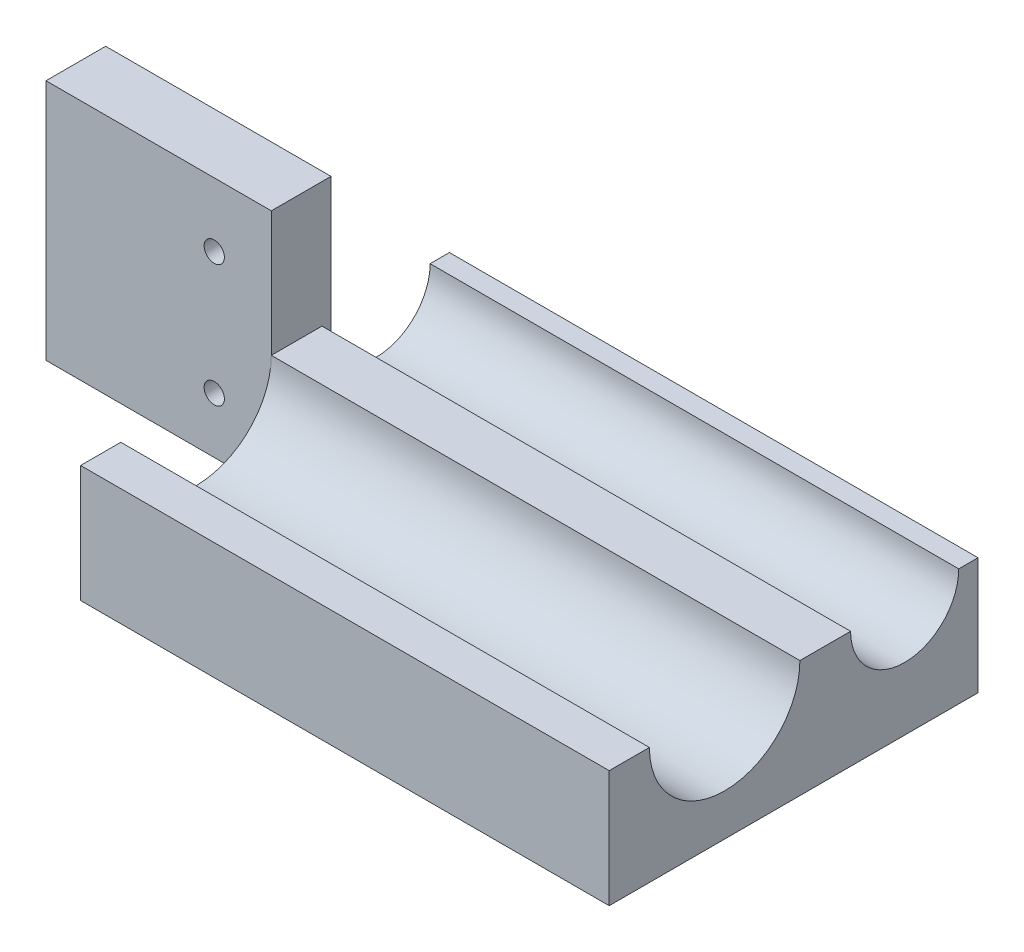
ISO-10303-21;
HEADER;
FILE_DESCRIPTION(('STEP AP214'),'2;1');
FILE_NAME('part.step','',(''),(''),'','','');
FILE_SCHEMA(('AUTOMOTIVE_DESIGN { 1 0 10303 214 1 1 1 1 }'));
ENDSEC;
DATA;
#1=APPLICATION_CONTEXT('core data for automotive mechanical design processes');
#2=APPLICATION_PROTOCOL_DEFINITION('international standard','automotive_design',2000,#1);
#3=PRODUCT_CONTEXT('',#1,'mechanical');
#4=PRODUCT('Part','Part','',(#3));
#5=PRODUCT_RELATED_PRODUCT_CATEGORY('part','',(#4));
#6=PRODUCT_DEFINITION_FORMATION('','',#4);
#7=PRODUCT_DEFINITION_CONTEXT('part definition',#1,'design');
#8=PRODUCT_DEFINITION('design','',#6,#7);
#9=PRODUCT_DEFINITION_SHAPE('','',#8);
#10=(LENGTH_UNIT() NAMED_UNIT(*) SI_UNIT(.MILLI.,.METRE.));
#11=(NAMED_UNIT(*) PLANE_ANGLE_UNIT() SI_UNIT($,.RADIAN.));
#12=(NAMED_UNIT(*) SI_UNIT($,.STERADIAN.) SOLID_ANGLE_UNIT());
#13=UNCERTAINTY_MEASURE_WITH_UNIT(LENGTH_MEASURE(1.E-05),#10,'distance_accuracy_value','');
#14=(GEOMETRIC_REPRESENTATION_CONTEXT(3) GLOBAL_UNCERTAINTY_ASSIGNED_CONTEXT((#13)) GLOBAL_UNIT_ASSIGNED_CONTEXT((#10,
#11,#12)) REPRESENTATION_CONTEXT('',''));
#15=CARTESIAN_POINT('',(0.,0.,0.));
#16=DIRECTION('',(0.,0.,1.));
#17=DIRECTION('',(1.,0.,0.));
#18=AXIS2_PLACEMENT_3D('',#15,#16,#17);
#19=CARTESIAN_POINT('',(-12.6639051339058,12.3607550837009,-35.9560648225148));
#20=DIRECTION('',(0.,0.,-1.));
#21=DIRECTION('',(-1.,0.,0.));
#22=AXIS2_PLACEMENT_3D('',#19,#20,#21);
#23=CYLINDRICAL_SURFACE('',#22,2.25);
#24=CARTESIAN_POINT('',(-12.6639051339058,12.3607550837009,-42.3200258531937));
#25=DIRECTION('',(0.,0.,-1.));
#26=DIRECTION('',(-1.,0.,0.));
#27=AXIS2_PLACEMENT_3D('',#24,#25,#26);
#28=CIRCLE('',#27,2.25);
#29=CARTESIAN_POINT('',(-14.9139051339058,12.3607550837009,-42.3200258531937));
#30=VERTEX_POINT('',#29);
#31=EDGE_CURVE('E228',#30,#30,#28,.F.);
#32=ORIENTED_EDGE('',*,*,#31,.T.);
#33=EDGE_LOOP('',(#32));
#34=FACE_BOUND('',#33,.T.);
#35=CARTESIAN_POINT('',(-12.6639051339058,12.3607550837009,-51.0625058614753));
#36=DIRECTION('',(0.,0.,-1.));
#37=DIRECTION('',(-1.,0.,0.));
#38=AXIS2_PLACEMENT_3D('',#35,#36,#37);
#39=CIRCLE('',#38,2.25);
#40=CARTESIAN_POINT('',(-14.9139051339058,12.3607550837009,-51.0625058614753));
#41=VERTEX_POINT('',#40);
#42=EDGE_CURVE('E41',#41,#41,#39,.F.);
#43=ORIENTED_EDGE('',*,*,#42,.F.);
#44=EDGE_LOOP('',(#43));
#45=FACE_BOUND('',#44,.T.);
#46=ADVANCED_FACE('F37',(#34,#45),#23,.F.);
#47=CARTESIAN_POINT('',(-12.6639051339058,39.5607550837009,-35.9560648225148));
#48=DIRECTION('',(0.,0.,-1.));
#49=DIRECTION('',(-1.,0.,0.));
#50=AXIS2_PLACEMENT_3D('',#47,#48,#49);
#51=CYLINDRICAL_SURFACE('',#50,2.25);
#52=CARTESIAN_POINT('',(-12.6639051339058,39.5607550837009,-42.3200258531937));
#53=DIRECTION('',(0.,0.,-1.));
#54=DIRECTION('',(-1.,0.,0.));
#55=AXIS2_PLACEMENT_3D('',#52,#53,#54);
#56=CIRCLE('',#55,2.25);
#57=CARTESIAN_POINT('',(-14.9139051339058,39.5607550837009,-42.3200258531937));
#58=VERTEX_POINT('',#57);
#59=EDGE_CURVE('E243',#58,#58,#56,.F.);
#60=ORIENTED_EDGE('',*,*,#59,.T.);
#61=EDGE_LOOP('',(#60));
#62=FACE_BOUND('',#61,.T.);
#63=CARTESIAN_POINT('',(-12.6639051339058,39.5607550837009,-51.0625058614753));
#64=DIRECTION('',(0.,0.,-1.));
#65=DIRECTION('',(-1.,0.,0.));
#66=AXIS2_PLACEMENT_3D('',#63,#64,#65);
#67=CIRCLE('',#66,2.25);
#68=CARTESIAN_POINT('',(-14.9139051339058,39.5607550837009,-51.0625058614753));
#69=VERTEX_POINT('',#68);
#70=EDGE_CURVE('E222',#69,#69,#67,.F.);
#71=ORIENTED_EDGE('',*,*,#70,.F.);
#72=EDGE_LOOP('',(#71));
#73=FACE_BOUND('',#72,.T.);
#74=ADVANCED_FACE('F304',(#62,#73),#51,.F.);
#75=CARTESIAN_POINT('',(0.,0.,0.));
#76=DIRECTION('',(1.,0.,0.));
#77=DIRECTION('',(0.,0.,-1.));
#78=AXIS2_PLACEMENT_3D('',#75,#76,#77);
#79=PLANE('',#78);
#80=DIRECTION('',(0.,-1.,0.));
#81=VECTOR('',#80,1.);
#82=CARTESIAN_POINT('',(0.,0.,-55.5625058614753));
#83=LINE('',#82,#81);
#84=CARTESIAN_POINT('',(0.,19.3275055029901,-55.5625058614753));
#85=VERTEX_POINT('',#84);
#86=CARTESIAN_POINT('',(0.,0.,-55.5625058614753));
#87=VERTEX_POINT('',#86);
#88=EDGE_CURVE('E11',#85,#87,#83,.T.);
#89=ORIENTED_EDGE('',*,*,#88,.F.);
#90=CARTESIAN_POINT('',(0.,25.9607550837009,-65.5625058614753));
#91=DIRECTION('',(1.,0.,0.));
#92=DIRECTION('',(0.,0.,-1.));
#93=AXIS2_PLACEMENT_3D('',#90,#91,#92);
#94=CIRCLE('',#93,12.);
#95=CARTESIAN_POINT('',(0.,25.9607550837009,-77.5625058614753));
#96=VERTEX_POINT('',#95);
#97=EDGE_CURVE('E155',#85,#96,#94,.T.);
#98=ORIENTED_EDGE('',*,*,#97,.T.);
#99=DIRECTION('',(0.,0.,-1.));
#100=VECTOR('',#99,1.);
#101=CARTESIAN_POINT('',(0.,25.9607550837006,1.05279507022553E-13));
#102=LINE('',#101,#100);
#103=CARTESIAN_POINT('',(0.,25.9607550837009,-81.8401409465382));
#104=VERTEX_POINT('',#103);
#105=EDGE_CURVE('E167',#96,#104,#102,.T.);
#106=ORIENTED_EDGE('',*,*,#105,.T.);
#107=DIRECTION('',(0.,1.,0.));
#108=VECTOR('',#107,1.);
#109=CARTESIAN_POINT('',(0.,0.,-81.8401409465382));
#110=LINE('',#109,#108);
#111=CARTESIAN_POINT('',(0.,0.,-81.8401409465382));
#112=VERTEX_POINT('',#111);
#113=EDGE_CURVE('E201',#112,#104,#110,.T.);
#114=ORIENTED_EDGE('',*,*,#113,.F.);
#115=DIRECTION('',(0.,0.,-1.));
#116=VECTOR('',#115,1.);
#117=CARTESIAN_POINT('',(0.,0.,0.));
#118=LINE('',#117,#116);
#119=EDGE_CURVE('E55',#87,#112,#118,.T.);
#120=ORIENTED_EDGE('',*,*,#119,.F.);
#121=EDGE_LOOP('',(#89,#98,#106,#114,#120));
#122=FACE_BOUND('',#121,.T.);
#123=ADVANCED_FACE('F270',(#122),#79,.F.);
#124=DIRECTION('',(0.,1.,0.));
#125=VECTOR('',#124,1.);
#126=CARTESIAN_POINT('',(0.,0.,-42.3200258531937));
#127=LINE('',#126,#125);
#128=CARTESIAN_POINT('',(0.,0.,-42.3200258531937));
#129=VERTEX_POINT('',#128);
#130=CARTESIAN_POINT('',(0.,25.9607550837009,-42.3200258531937));
#131=VERTEX_POINT('',#130);
#132=EDGE_CURVE('E62',#129,#131,#127,.T.);
#133=ORIENTED_EDGE('',*,*,#132,.F.);
#134=CARTESIAN_POINT('',(0.,0.,0.));
#135=VERTEX_POINT('',#134);
#136=EDGE_CURVE('E199',#135,#129,#118,.T.);
#137=ORIENTED_EDGE('',*,*,#136,.F.);
#138=DIRECTION('',(0.,1.,0.));
#139=VECTOR('',#138,1.);
#140=CARTESIAN_POINT('',(0.,0.,0.));
#141=LINE('',#140,#139);
#142=CARTESIAN_POINT('',(0.,25.9607550837009,0.));
#143=VERTEX_POINT('',#142);
#144=EDGE_CURVE('E196',#135,#143,#141,.T.);
#145=ORIENTED_EDGE('',*,*,#144,.T.);
#146=DIRECTION('',(0.,0.,-1.));
#147=VECTOR('',#146,1.);
#148=CARTESIAN_POINT('',(0.,25.9607550837009,0.));
#149=LINE('',#148,#147);
#150=CARTESIAN_POINT('',(0.,25.9607550837009,-8.9200258531937));
#151=VERTEX_POINT('',#150);
#152=EDGE_CURVE('E193',#143,#151,#149,.T.);
#153=ORIENTED_EDGE('',*,*,#152,.T.);
#154=CARTESIAN_POINT('',(0.,25.9607550837009,-25.6200258531937));
#155=DIRECTION('',(1.,0.,0.));
#156=DIRECTION('',(0.,0.,-1.));
#157=AXIS2_PLACEMENT_3D('',#154,#155,#156);
#158=CIRCLE('',#157,16.7);
#159=EDGE_CURVE('E191',#151,#131,#158,.T.);
#160=ORIENTED_EDGE('',*,*,#159,.T.);
#161=EDGE_LOOP('',(#133,#137,#145,#153,#160));
#162=FACE_BOUND('',#161,.T.);
#163=ADVANCED_FACE('F289',(#162),#79,.F.);
#164=CARTESIAN_POINT('',(117.3,25.9607550837009,-65.5625058614753));
#165=DIRECTION('',(-1.,0.,0.));
#166=DIRECTION('',(0.,0.,1.));
#167=AXIS2_PLACEMENT_3D('',#164,#165,#166);
#168=CYLINDRICAL_SURFACE('',#167,12.);
#169=CARTESIAN_POINT('',(0.,25.9607550837009,-53.5625058614753));
#170=VERTEX_POINT('',#169);
#171=EDGE_CURVE('E157',#170,#85,#94,.T.);
#172=ORIENTED_EDGE('',*,*,#171,.F.);
#173=DIRECTION('',(-1.,0.,0.));
#174=VECTOR('',#173,1.);
#175=CARTESIAN_POINT('',(117.3,25.9607550837009,-53.5625058614753));
#176=LINE('',#175,#174);
#177=CARTESIAN_POINT('',(117.3,25.9607550837009,-53.5625058614753));
#178=VERTEX_POINT('',#177);
#179=EDGE_CURVE('E46',#178,#170,#176,.T.);
#180=ORIENTED_EDGE('',*,*,#179,.F.);
#181=CARTESIAN_POINT('',(117.3,25.9607550837009,-65.5625058614753));
#182=DIRECTION('',(1.,0.,0.));
#183=DIRECTION('',(0.,0.,-1.));
#184=AXIS2_PLACEMENT_3D('',#181,#182,#183);
#185=CIRCLE('',#184,12.);
#186=CARTESIAN_POINT('',(117.3,25.9607550837009,-77.5625058614753));
#187=VERTEX_POINT('',#186);
#188=EDGE_CURVE('E163',#178,#187,#185,.T.);
#189=ORIENTED_EDGE('',*,*,#188,.T.);
#190=DIRECTION('',(-1.,0.,0.));
#191=VECTOR('',#190,1.);
#192=CARTESIAN_POINT('',(117.3,25.9607550837009,-77.5625058614753));
#193=LINE('',#192,#191);
#194=EDGE_CURVE('E185',#187,#96,#193,.T.);
#195=ORIENTED_EDGE('',*,*,#194,.T.);
#196=ORIENTED_EDGE('',*,*,#97,.F.);
#197=EDGE_LOOP('',(#172,#180,#189,#195,#196));
#198=FACE_BOUND('',#197,.T.);
#199=ADVANCED_FACE('F39',(#198),#168,.F.);
#200=CARTESIAN_POINT('',(117.3,25.9607550837009,0.));
#201=DIRECTION('',(0.,1.,0.));
#202=DIRECTION('',(0.,0.,1.));
#203=AXIS2_PLACEMENT_3D('',#200,#201,#202);
#204=PLANE('',#203);
#205=DIRECTION('',(0.,0.,-1.));
#206=VECTOR('',#205,1.);
#207=CARTESIAN_POINT('',(0.,25.9607550837009,0.));
#208=LINE('',#207,#206);
#209=EDGE_CURVE('E188',#131,#170,#208,.T.);
#210=ORIENTED_EDGE('',*,*,#209,.F.);
#211=DIRECTION('',(-1.,0.,0.));
#212=VECTOR('',#211,1.);
#213=CARTESIAN_POINT('',(117.3,25.9607550837009,-42.3200258531937));
#214=LINE('',#213,#212);
#215=CARTESIAN_POINT('',(117.3,25.9607550837009,-42.3200258531937));
#216=VERTEX_POINT('',#215);
#217=EDGE_CURVE('E219',#216,#131,#214,.T.);
#218=ORIENTED_EDGE('',*,*,#217,.F.);
#219=DIRECTION('',(0.,0.,-1.));
#220=VECTOR('',#219,1.);
#221=CARTESIAN_POINT('',(117.3,25.9607550837009,0.));
#222=LINE('',#221,#220);
#223=EDGE_CURVE('E166',#216,#178,#222,.T.);
#224=ORIENTED_EDGE('',*,*,#223,.T.);
#225=ORIENTED_EDGE('',*,*,#179,.T.);
#226=EDGE_LOOP('',(#210,#218,#224,#225));
#227=FACE_BOUND('',#226,.T.);
#228=ADVANCED_FACE('F411',(#227),#204,.T.);
#229=CARTESIAN_POINT('',(117.3,25.9607550837009,-25.6200258531937));
#230=DIRECTION('',(-1.,0.,0.));
#231=DIRECTION('',(0.,0.,1.));
#232=AXIS2_PLACEMENT_3D('',#229,#230,#231);
#233=CYLINDRICAL_SURFACE('',#232,16.7);
#234=ORIENTED_EDGE('',*,*,#159,.F.);
#235=DIRECTION('',(-1.,0.,0.));
#236=VECTOR('',#235,1.);
#237=CARTESIAN_POINT('',(117.3,25.9607550837009,-8.9200258531937));
#238=LINE('',#237,#236);
#239=CARTESIAN_POINT('',(117.3,25.9607550837009,-8.9200258531937));
#240=VERTEX_POINT('',#239);
#241=EDGE_CURVE('E217',#240,#151,#238,.T.);
#242=ORIENTED_EDGE('',*,*,#241,.F.);
#243=CARTESIAN_POINT('',(117.3,25.9607550837009,-25.6200258531937));
#244=DIRECTION('',(1.,0.,0.));
#245=DIRECTION('',(0.,0.,-1.));
#246=AXIS2_PLACEMENT_3D('',#243,#244,#245);
#247=CIRCLE('',#246,16.7);
#248=EDGE_CURVE('E170',#240,#216,#247,.T.);
#249=ORIENTED_EDGE('',*,*,#248,.T.);
#250=ORIENTED_EDGE('',*,*,#217,.T.);
#251=EDGE_LOOP('',(#234,#242,#249,#250));
#252=FACE_BOUND('',#251,.T.);
#253=ADVANCED_FACE('F416',(#252),#233,.F.);
#254=CARTESIAN_POINT('',(117.3,25.9607550837009,0.));
#255=DIRECTION('',(0.,1.,0.));
#256=DIRECTION('',(0.,0.,1.));
#257=AXIS2_PLACEMENT_3D('',#254,#255,#256);
#258=PLANE('',#257);
#259=ORIENTED_EDGE('',*,*,#152,.F.);
#260=DIRECTION('',(-1.,0.,0.));
#261=VECTOR('',#260,1.);
#262=CARTESIAN_POINT('',(117.3,25.9607550837009,0.));
#263=LINE('',#262,#261);
#264=CARTESIAN_POINT('',(117.3,25.9607550837009,0.));
#265=VERTEX_POINT('',#264);
#266=EDGE_CURVE('E215',#265,#143,#263,.T.);
#267=ORIENTED_EDGE('',*,*,#266,.F.);
#268=DIRECTION('',(0.,0.,-1.));
#269=VECTOR('',#268,1.);
#270=CARTESIAN_POINT('',(117.3,25.9607550837009,0.));
#271=LINE('',#270,#269);
#272=EDGE_CURVE('E173',#265,#240,#271,.T.);
#273=ORIENTED_EDGE('',*,*,#272,.T.);
#274=ORIENTED_EDGE('',*,*,#241,.T.);
#275=EDGE_LOOP('',(#259,#267,#273,#274));
#276=FACE_BOUND('',#275,.T.);
#277=ADVANCED_FACE('F469',(#276),#258,.T.);
#278=CARTESIAN_POINT('',(117.3,0.,0.));
#279=DIRECTION('',(0.,0.,1.));
#280=DIRECTION('',(1.,0.,0.));
#281=AXIS2_PLACEMENT_3D('',#278,#279,#280);
#282=PLANE('',#281);
#283=ORIENTED_EDGE('',*,*,#144,.F.);
#284=DIRECTION('',(-1.,0.,0.));
#285=VECTOR('',#284,1.);
#286=CARTESIAN_POINT('',(117.3,0.,0.));
#287=LINE('',#286,#285);
#288=CARTESIAN_POINT('',(117.3,0.,0.));
#289=VERTEX_POINT('',#288);
#290=EDGE_CURVE('E213',#289,#135,#287,.T.);
#291=ORIENTED_EDGE('',*,*,#290,.F.);
#292=DIRECTION('',(0.,1.,0.));
#293=VECTOR('',#292,1.);
#294=CARTESIAN_POINT('',(117.3,0.,0.));
#295=LINE('',#294,#293);
#296=EDGE_CURVE('E176',#289,#265,#295,.T.);
#297=ORIENTED_EDGE('',*,*,#296,.T.);
#298=ORIENTED_EDGE('',*,*,#266,.T.);
#299=EDGE_LOOP('',(#283,#291,#297,#298));
#300=FACE_BOUND('',#299,.T.);
#301=ADVANCED_FACE('F287',(#300),#282,.T.);
#302=CARTESIAN_POINT('',(117.3,0.,0.));
#303=DIRECTION('',(0.,1.,0.));
#304=DIRECTION('',(0.,0.,1.));
#305=AXIS2_PLACEMENT_3D('',#302,#303,#304);
#306=PLANE('',#305);
#307=ORIENTED_EDGE('',*,*,#136,.T.);
#308=DIRECTION('',(1.,0.,0.));
#309=VECTOR('',#308,1.);
#310=CARTESIAN_POINT('',(-50.,0.,-42.3200258531937));
#311=LINE('',#310,#309);
#312=CARTESIAN_POINT('',(-50.,0.,-42.3200258531937));
#313=VERTEX_POINT('',#312);
#314=EDGE_CURVE('E138',#313,#129,#311,.T.);
#315=ORIENTED_EDGE('',*,*,#314,.F.);
#316=DIRECTION('',(0.,0.,1.));
#317=VECTOR('',#316,1.);
#318=CARTESIAN_POINT('',(-50.,0.,-55.5625058614753));
#319=LINE('',#318,#317);
#320=CARTESIAN_POINT('',(-50.,0.,-55.5625058614753));
#321=VERTEX_POINT('',#320);
#322=EDGE_CURVE('E132',#321,#313,#319,.T.);
#323=ORIENTED_EDGE('',*,*,#322,.F.);
#324=DIRECTION('',(1.,0.,0.));
#325=VECTOR('',#324,1.);
#326=CARTESIAN_POINT('',(-50.,0.,-55.5625058614753));
#327=LINE('',#326,#325);
#328=EDGE_CURVE('E136',#321,#87,#327,.T.);
#329=ORIENTED_EDGE('',*,*,#328,.T.);
#330=ORIENTED_EDGE('',*,*,#119,.T.);
#331=DIRECTION('',(-1.,0.,0.));
#332=VECTOR('',#331,1.);
#333=CARTESIAN_POINT('',(117.3,0.,-81.8401409465382));
#334=LINE('',#333,#332);
#335=CARTESIAN_POINT('',(117.3,0.,-81.8401409465382));
#336=VERTEX_POINT('',#335);
#337=EDGE_CURVE('E210',#336,#112,#334,.T.);
#338=ORIENTED_EDGE('',*,*,#337,.F.);
#339=DIRECTION('',(0.,0.,-1.));
#340=VECTOR('',#339,1.);
#341=CARTESIAN_POINT('',(117.3,0.,0.));
#342=LINE('',#341,#340);
#343=EDGE_CURVE('E179',#289,#336,#342,.T.);
#344=ORIENTED_EDGE('',*,*,#343,.F.);
#345=ORIENTED_EDGE('',*,*,#290,.T.);
#346=EDGE_LOOP('',(#307,#315,#323,#329,#330,#338,#344,#345));
#347=FACE_BOUND('',#346,.T.);
#348=ADVANCED_FACE('F134',(#347),#306,.F.);
#349=CARTESIAN_POINT('',(117.3,0.,-81.8401409465382));
#350=DIRECTION('',(0.,0.,1.));
#351=DIRECTION('',(0.,-1.,0.));
#352=AXIS2_PLACEMENT_3D('',#349,#350,#351);
#353=PLANE('',#352);
#354=ORIENTED_EDGE('',*,*,#113,.T.);
#355=DIRECTION('',(-1.,0.,0.));
#356=VECTOR('',#355,1.);
#357=CARTESIAN_POINT('',(117.3,25.9607550837009,-81.8401409465382));
#358=LINE('',#357,#356);
#359=CARTESIAN_POINT('',(117.3,25.9607550837009,-81.8401409465382));
#360=VERTEX_POINT('',#359);
#361=EDGE_CURVE('E208',#360,#104,#358,.T.);
#362=ORIENTED_EDGE('',*,*,#361,.F.);
#363=DIRECTION('',(0.,1.,0.));
#364=VECTOR('',#363,1.);
#365=CARTESIAN_POINT('',(117.3,0.,-81.8401409465382));
#366=LINE('',#365,#364);
#367=EDGE_CURVE('E181',#336,#360,#366,.T.);
#368=ORIENTED_EDGE('',*,*,#367,.F.);
#369=ORIENTED_EDGE('',*,*,#337,.T.);
#370=EDGE_LOOP('',(#354,#362,#368,#369));
#371=FACE_BOUND('',#370,.T.);
#372=ADVANCED_FACE('F277',(#371),#353,.F.);
#373=CARTESIAN_POINT('',(117.3,25.9607550837006,1.05279507022553E-13));
#374=DIRECTION('',(0.,1.,0.));
#375=DIRECTION('',(0.,0.,1.));
#376=AXIS2_PLACEMENT_3D('',#373,#374,#375);
#377=PLANE('',#376);
#378=ORIENTED_EDGE('',*,*,#105,.F.);
#379=ORIENTED_EDGE('',*,*,#194,.F.);
#380=DIRECTION('',(0.,0.,-1.));
#381=VECTOR('',#380,1.);
#382=CARTESIAN_POINT('',(117.3,25.9607550837006,1.05279507022553E-13));
#383=LINE('',#382,#381);
#384=EDGE_CURVE('E183',#187,#360,#383,.T.);
#385=ORIENTED_EDGE('',*,*,#384,.T.);
#386=ORIENTED_EDGE('',*,*,#361,.T.);
#387=EDGE_LOOP('',(#378,#379,#385,#386));
#388=FACE_BOUND('',#387,.T.);
#389=ADVANCED_FACE('F272',(#388),#377,.T.);
#390=CARTESIAN_POINT('',(117.3,0.,0.));
#391=DIRECTION('',(1.,0.,0.));
#392=DIRECTION('',(0.,0.,-1.));
#393=AXIS2_PLACEMENT_3D('',#390,#391,#392);
#394=PLANE('',#393);
#395=ORIENTED_EDGE('',*,*,#188,.F.);
#396=ORIENTED_EDGE('',*,*,#223,.F.);
#397=ORIENTED_EDGE('',*,*,#248,.F.);
#398=ORIENTED_EDGE('',*,*,#272,.F.);
#399=ORIENTED_EDGE('',*,*,#296,.F.);
#400=ORIENTED_EDGE('',*,*,#343,.T.);
#401=ORIENTED_EDGE('',*,*,#367,.T.);
#402=ORIENTED_EDGE('',*,*,#384,.F.);
#403=EDGE_LOOP('',(#395,#396,#397,#398,#399,#400,#401,#402));
#404=FACE_BOUND('',#403,.T.);
#405=ADVANCED_FACE('F283',(#404),#394,.T.);
#406=CARTESIAN_POINT('',(-50.,0.,-55.5625058614753));
#407=DIRECTION('',(0.,0.,1.));
#408=DIRECTION('',(1.,0.,0.));
#409=AXIS2_PLACEMENT_3D('',#406,#407,#408);
#410=PLANE('',#409);
#411=CARTESIAN_POINT('',(-12.6639051339058,39.5607550837009,-55.5625058614753));
#412=DIRECTION('',(0.,0.,-1.));
#413=DIRECTION('',(-1.,0.,0.));
#414=AXIS2_PLACEMENT_3D('',#411,#412,#413);
#415=CIRCLE('',#414,5.25);
#416=CARTESIAN_POINT('',(-17.9139051339058,39.5607550837009,-55.5625058614753));
#417=VERTEX_POINT('',#416);
#418=EDGE_CURVE('E230',#417,#417,#415,.T.);
#419=ORIENTED_EDGE('',*,*,#418,.F.);
#420=EDGE_LOOP('',(#419));
#421=FACE_BOUND('',#420,.T.);
#422=CARTESIAN_POINT('',(-12.6639051339058,12.3607550837009,-55.5625058614753));
#423=DIRECTION('',(0.,0.,-1.));
#424=DIRECTION('',(-1.,0.,0.));
#425=AXIS2_PLACEMENT_3D('',#422,#423,#424);
#426=CIRCLE('',#425,4.93022529094973);
#427=CARTESIAN_POINT('',(-17.5941304248555,12.3607550837009,-55.5625058614753));
#428=VERTEX_POINT('',#427);
#429=EDGE_CURVE('E240',#428,#428,#426,.T.);
#430=ORIENTED_EDGE('',*,*,#429,.F.);
#431=EDGE_LOOP('',(#430));
#432=FACE_BOUND('',#431,.T.);
#433=CARTESIAN_POINT('',(0.,53.7409284990673,-55.5625058614753));
#434=VERTEX_POINT('',#433);
#435=EDGE_CURVE('E48',#434,#85,#83,.T.);
#436=ORIENTED_EDGE('',*,*,#435,.T.);
#437=ORIENTED_EDGE('',*,*,#88,.T.);
#438=ORIENTED_EDGE('',*,*,#328,.F.);
#439=DIRECTION('',(0.,-1.,0.));
#440=VECTOR('',#439,1.);
#441=CARTESIAN_POINT('',(-50.,0.,-55.5625058614753));
#442=LINE('',#441,#440);
#443=CARTESIAN_POINT('',(-50.,53.7409284990673,-55.5625058614753));
#444=VERTEX_POINT('',#443);
#445=EDGE_CURVE('E142',#444,#321,#442,.T.);
#446=ORIENTED_EDGE('',*,*,#445,.F.);
#447=DIRECTION('',(1.,0.,0.));
#448=VECTOR('',#447,1.);
#449=CARTESIAN_POINT('',(-50.,53.7409284990673,-55.5625058614753));
#450=LINE('',#449,#448);
#451=EDGE_CURVE('E249',#444,#434,#450,.T.);
#452=ORIENTED_EDGE('',*,*,#451,.T.);
#453=EDGE_LOOP('',(#436,#437,#438,#446,#452));
#454=FACE_BOUND('',#453,.T.);
#455=ADVANCED_FACE('F154',(#421,#432,#454),#410,.F.);
#456=CARTESIAN_POINT('',(-50.,0.,-42.3200258531937));
#457=DIRECTION('',(0.,0.,-1.));
#458=DIRECTION('',(-1.,0.,0.));
#459=AXIS2_PLACEMENT_3D('',#456,#457,#458);
#460=PLANE('',#459);
#461=ORIENTED_EDGE('',*,*,#59,.F.);
#462=EDGE_LOOP('',(#461));
#463=FACE_BOUND('',#462,.T.);
#464=ORIENTED_EDGE('',*,*,#31,.F.);
#465=EDGE_LOOP('',(#464));
#466=FACE_BOUND('',#465,.T.);
#467=ORIENTED_EDGE('',*,*,#132,.T.);
#468=CARTESIAN_POINT('',(0.,53.7409284990673,-42.3200258531937));
#469=VERTEX_POINT('',#468);
#470=EDGE_CURVE('E251',#131,#469,#127,.T.);
#471=ORIENTED_EDGE('',*,*,#470,.T.);
#472=DIRECTION('',(1.,0.,0.));
#473=VECTOR('',#472,1.);
#474=CARTESIAN_POINT('',(-50.,53.7409284990673,-42.3200258531937));
#475=LINE('',#474,#473);
#476=CARTESIAN_POINT('',(-50.,53.7409284990673,-42.3200258531937));
#477=VERTEX_POINT('',#476);
#478=EDGE_CURVE('E159',#477,#469,#475,.T.);
#479=ORIENTED_EDGE('',*,*,#478,.F.);
#480=DIRECTION('',(0.,1.,0.));
#481=VECTOR('',#480,1.);
#482=CARTESIAN_POINT('',(-50.,0.,-42.3200258531937));
#483=LINE('',#482,#481);
#484=EDGE_CURVE('E141',#313,#477,#483,.T.);
#485=ORIENTED_EDGE('',*,*,#484,.F.);
#486=ORIENTED_EDGE('',*,*,#314,.T.);
#487=EDGE_LOOP('',(#467,#471,#479,#485,#486));
#488=FACE_BOUND('',#487,.T.);
#489=ADVANCED_FACE('F290',(#463,#466,#488),#460,.F.);
#490=CARTESIAN_POINT('',(-50.,53.7409284990673,-55.5625058614753));
#491=DIRECTION('',(0.,-1.,0.));
#492=DIRECTION('',(0.,0.,-1.));
#493=AXIS2_PLACEMENT_3D('',#490,#491,#492);
#494=PLANE('',#493);
#495=DIRECTION('',(0.,0.,-1.));
#496=VECTOR('',#495,1.);
#497=CARTESIAN_POINT('',(0.,53.7409284990673,-55.5625058614753));
#498=LINE('',#497,#496);
#499=EDGE_CURVE('E151',#469,#434,#498,.T.);
#500=ORIENTED_EDGE('',*,*,#499,.T.);
#501=ORIENTED_EDGE('',*,*,#451,.F.);
#502=DIRECTION('',(0.,0.,-1.));
#503=VECTOR('',#502,1.);
#504=CARTESIAN_POINT('',(-50.,53.7409284990673,-55.5625058614753));
#505=LINE('',#504,#503);
#506=EDGE_CURVE('E147',#477,#444,#505,.T.);
#507=ORIENTED_EDGE('',*,*,#506,.F.);
#508=ORIENTED_EDGE('',*,*,#478,.T.);
#509=EDGE_LOOP('',(#500,#501,#507,#508));
#510=FACE_BOUND('',#509,.T.);
#511=ADVANCED_FACE('F258',(#510),#494,.F.);
#512=CARTESIAN_POINT('',(-50.,0.,0.));
#513=DIRECTION('',(1.,0.,0.));
#514=DIRECTION('',(0.,0.,-1.));
#515=AXIS2_PLACEMENT_3D('',#512,#513,#514);
#516=PLANE('',#515);
#517=ORIENTED_EDGE('',*,*,#445,.T.);
#518=ORIENTED_EDGE('',*,*,#322,.T.);
#519=ORIENTED_EDGE('',*,*,#484,.T.);
#520=ORIENTED_EDGE('',*,*,#506,.T.);
#521=EDGE_LOOP('',(#517,#518,#519,#520));
#522=FACE_BOUND('',#521,.T.);
#523=ADVANCED_FACE('F145',(#522),#516,.F.);
#524=CARTESIAN_POINT('',(0.,0.,0.));
#525=DIRECTION('',(1.,0.,0.));
#526=DIRECTION('',(0.,0.,-1.));
#527=AXIS2_PLACEMENT_3D('',#524,#525,#526);
#528=PLANE('',#527);
#529=ORIENTED_EDGE('',*,*,#209,.T.);
#530=ORIENTED_EDGE('',*,*,#171,.T.);
#531=ORIENTED_EDGE('',*,*,#435,.F.);
#532=ORIENTED_EDGE('',*,*,#499,.F.);
#533=ORIENTED_EDGE('',*,*,#470,.F.);
#534=EDGE_LOOP('',(#529,#530,#531,#532,#533));
#535=FACE_BOUND('',#534,.T.);
#536=ADVANCED_FACE('F263',(#535),#528,.T.);
#537=CARTESIAN_POINT('',(-12.6639051339058,39.5607550837009,-51.0625058614753));
#538=DIRECTION('',(0.,0.,-1.));
#539=DIRECTION('',(-1.,0.,0.));
#540=AXIS2_PLACEMENT_3D('',#537,#538,#539);
#541=PLANE('',#540);
#542=CARTESIAN_POINT('',(-12.6639051339058,39.5607550837009,-51.0625058614753));
#543=DIRECTION('',(0.,0.,-1.));
#544=DIRECTION('',(-1.,0.,0.));
#545=AXIS2_PLACEMENT_3D('',#542,#543,#544);
#546=CIRCLE('',#545,5.25);
#547=CARTESIAN_POINT('',(-17.9139051339058,39.5607550837009,-51.0625058614753));
#548=VERTEX_POINT('',#547);
#549=EDGE_CURVE('E224',#548,#548,#546,.T.);
#550=ORIENTED_EDGE('',*,*,#549,.T.);
#551=EDGE_LOOP('',(#550));
#552=FACE_BOUND('',#551,.T.);
#553=ORIENTED_EDGE('',*,*,#70,.T.);
#554=EDGE_LOOP('',(#553));
#555=FACE_BOUND('',#554,.T.);
#556=ADVANCED_FACE('F318',(#552,#555),#541,.T.);
#557=CARTESIAN_POINT('',(-12.6639051339058,39.5607550837009,-51.0625058614753));
#558=DIRECTION('',(0.,0.,-1.));
#559=DIRECTION('',(-1.,0.,0.));
#560=AXIS2_PLACEMENT_3D('',#557,#558,#559);
#561=CYLINDRICAL_SURFACE('',#560,5.25);
#562=ORIENTED_EDGE('',*,*,#549,.F.);
#563=EDGE_LOOP('',(#562));
#564=FACE_BOUND('',#563,.T.);
#565=ORIENTED_EDGE('',*,*,#418,.T.);
#566=EDGE_LOOP('',(#565));
#567=FACE_BOUND('',#566,.T.);
#568=ADVANCED_FACE('F322',(#564,#567),#561,.F.);
#569=CARTESIAN_POINT('',(-12.6639051339058,12.3607550837009,-51.0625058614753));
#570=DIRECTION('',(0.,0.,-1.));
#571=DIRECTION('',(-1.,0.,0.));
#572=AXIS2_PLACEMENT_3D('',#569,#570,#571);
#573=PLANE('',#572);
#574=CARTESIAN_POINT('',(-12.6639051339058,12.3607550837009,-51.0625058614753));
#575=DIRECTION('',(0.,0.,-1.));
#576=DIRECTION('',(-1.,0.,0.));
#577=AXIS2_PLACEMENT_3D('',#574,#575,#576);
#578=CIRCLE('',#577,4.93022529094973);
#579=CARTESIAN_POINT('',(-17.5941304248555,12.3607550837009,-51.0625058614753));
#580=VERTEX_POINT('',#579);
#581=EDGE_CURVE('E235',#580,#580,#578,.T.);
#582=ORIENTED_EDGE('',*,*,#581,.T.);
#583=EDGE_LOOP('',(#582));
#584=FACE_BOUND('',#583,.T.);
#585=ORIENTED_EDGE('',*,*,#42,.T.);
#586=EDGE_LOOP('',(#585));
#587=FACE_BOUND('',#586,.T.);
#588=ADVANCED_FACE('F327',(#584,#587),#573,.T.);
#589=CARTESIAN_POINT('',(-12.6639051339058,12.3607550837009,-51.0625058614753));
#590=DIRECTION('',(0.,0.,-1.));
#591=DIRECTION('',(-1.,0.,0.));
#592=AXIS2_PLACEMENT_3D('',#589,#590,#591);
#593=CYLINDRICAL_SURFACE('',#592,4.93022529094973);
#594=ORIENTED_EDGE('',*,*,#581,.F.);
#595=EDGE_LOOP('',(#594));
#596=FACE_BOUND('',#595,.T.);
#597=ORIENTED_EDGE('',*,*,#429,.T.);
#598=EDGE_LOOP('',(#597));
#599=FACE_BOUND('',#598,.T.);
#600=ADVANCED_FACE('F332',(#596,#599),#593,.F.);
#601=CLOSED_SHELL('',(#46,#74,#123,#163,#199,#228,#253,#277,#301,#348,#372,#389,#405,#455,#489,
#511,#523,#536,#556,#568,#588,#600));
#602=MANIFOLD_SOLID_BREP('B2',#601);
#603=ADVANCED_BREP_SHAPE_REPRESENTATION('',(#18,#602),#14);
#604=SHAPE_DEFINITION_REPRESENTATION(#9,#603);
ENDSEC;
END-ISO-10303-21;
